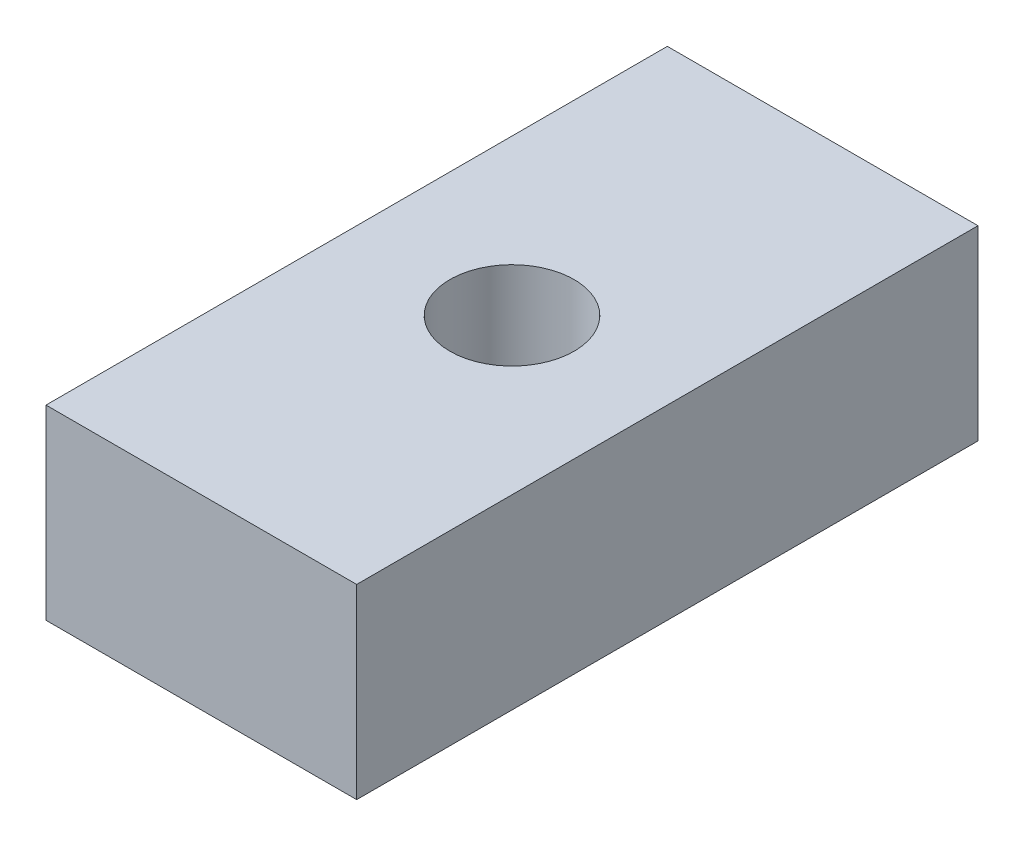
ISO-10303-21;
HEADER;
FILE_DESCRIPTION(('STEP AP214'),'2;1');
FILE_NAME('part.step','',(''),(''),'','','');
FILE_SCHEMA(('AUTOMOTIVE_DESIGN { 1 0 10303 214 1 1 1 1 }'));
ENDSEC;
DATA;
#1=APPLICATION_CONTEXT('core data for automotive mechanical design processes');
#2=APPLICATION_PROTOCOL_DEFINITION('international standard','automotive_design',2000,#1);
#3=PRODUCT_CONTEXT('',#1,'mechanical');
#4=PRODUCT('Part','Part','',(#3));
#5=PRODUCT_RELATED_PRODUCT_CATEGORY('part','',(#4));
#6=PRODUCT_DEFINITION_FORMATION('','',#4);
#7=PRODUCT_DEFINITION_CONTEXT('part definition',#1,'design');
#8=PRODUCT_DEFINITION('design','',#6,#7);
#9=PRODUCT_DEFINITION_SHAPE('','',#8);
#10=(LENGTH_UNIT() NAMED_UNIT(*) SI_UNIT(.MILLI.,.METRE.));
#11=(NAMED_UNIT(*) PLANE_ANGLE_UNIT() SI_UNIT($,.RADIAN.));
#12=(NAMED_UNIT(*) SI_UNIT($,.STERADIAN.) SOLID_ANGLE_UNIT());
#13=UNCERTAINTY_MEASURE_WITH_UNIT(LENGTH_MEASURE(1.E-05),#10,'distance_accuracy_value','');
#14=(GEOMETRIC_REPRESENTATION_CONTEXT(3) GLOBAL_UNCERTAINTY_ASSIGNED_CONTEXT((#13)) GLOBAL_UNIT_ASSIGNED_CONTEXT((#10,
#11,#12)) REPRESENTATION_CONTEXT('',''));
#15=CARTESIAN_POINT('',(0.,0.,0.));
#16=DIRECTION('',(0.,0.,1.));
#17=DIRECTION('',(1.,0.,0.));
#18=AXIS2_PLACEMENT_3D('',#15,#16,#17);
#19=CARTESIAN_POINT('',(0.,3.,0.));
#20=DIRECTION('',(1.,0.,0.));
#21=DIRECTION('',(0.,0.,-1.));
#22=AXIS2_PLACEMENT_3D('',#19,#20,#21);
#23=PLANE('',#22);
#24=DIRECTION('',(0.,0.,1.));
#25=VECTOR('',#24,1.);
#26=CARTESIAN_POINT('',(0.,0.,0.));
#27=LINE('',#26,#25);
#28=CARTESIAN_POINT('',(0.,0.,0.));
#29=VERTEX_POINT('',#28);
#30=CARTESIAN_POINT('',(0.,0.,10.));
#31=VERTEX_POINT('',#30);
#32=EDGE_CURVE('E96',#29,#31,#27,.T.);
#33=ORIENTED_EDGE('',*,*,#32,.T.);
#34=DIRECTION('',(0.,-1.,0.));
#35=VECTOR('',#34,1.);
#36=CARTESIAN_POINT('',(0.,3.,10.));
#37=LINE('',#36,#35);
#38=CARTESIAN_POINT('',(0.,3.,10.));
#39=VERTEX_POINT('',#38);
#40=EDGE_CURVE('E11',#39,#31,#37,.T.);
#41=ORIENTED_EDGE('',*,*,#40,.F.);
#42=DIRECTION('',(0.,0.,1.));
#43=VECTOR('',#42,1.);
#44=CARTESIAN_POINT('',(0.,3.,0.));
#45=LINE('',#44,#43);
#46=CARTESIAN_POINT('',(0.,3.,0.));
#47=VERTEX_POINT('',#46);
#48=EDGE_CURVE('E84',#47,#39,#45,.T.);
#49=ORIENTED_EDGE('',*,*,#48,.F.);
#50=DIRECTION('',(0.,-1.,0.));
#51=VECTOR('',#50,1.);
#52=CARTESIAN_POINT('',(0.,3.,0.));
#53=LINE('',#52,#51);
#54=EDGE_CURVE('E92',#47,#29,#53,.T.);
#55=ORIENTED_EDGE('',*,*,#54,.T.);
#56=EDGE_LOOP('',(#33,#41,#49,#55));
#57=FACE_BOUND('',#56,.T.);
#58=ADVANCED_FACE('F33',(#57),#23,.F.);
#59=CARTESIAN_POINT('',(0.,3.,10.));
#60=DIRECTION('',(0.,0.,-1.));
#61=DIRECTION('',(-1.,0.,0.));
#62=AXIS2_PLACEMENT_3D('',#59,#60,#61);
#63=PLANE('',#62);
#64=DIRECTION('',(1.,0.,0.));
#65=VECTOR('',#64,1.);
#66=CARTESIAN_POINT('',(0.,0.,10.));
#67=LINE('',#66,#65);
#68=CARTESIAN_POINT('',(5.,0.,10.));
#69=VERTEX_POINT('',#68);
#70=EDGE_CURVE('E88',#31,#69,#67,.T.);
#71=ORIENTED_EDGE('',*,*,#70,.T.);
#72=DIRECTION('',(0.,-1.,0.));
#73=VECTOR('',#72,1.);
#74=CARTESIAN_POINT('',(5.,3.,10.));
#75=LINE('',#74,#73);
#76=CARTESIAN_POINT('',(5.,3.,10.));
#77=VERTEX_POINT('',#76);
#78=EDGE_CURVE('E41',#77,#69,#75,.T.);
#79=ORIENTED_EDGE('',*,*,#78,.F.);
#80=DIRECTION('',(1.,0.,0.));
#81=VECTOR('',#80,1.);
#82=CARTESIAN_POINT('',(0.,3.,10.));
#83=LINE('',#82,#81);
#84=EDGE_CURVE('E79',#39,#77,#83,.T.);
#85=ORIENTED_EDGE('',*,*,#84,.F.);
#86=ORIENTED_EDGE('',*,*,#40,.T.);
#87=EDGE_LOOP('',(#71,#79,#85,#86));
#88=FACE_BOUND('',#87,.T.);
#89=ADVANCED_FACE('F87',(#88),#63,.F.);
#90=CARTESIAN_POINT('',(5.,3.,0.));
#91=DIRECTION('',(-1.,0.,0.));
#92=DIRECTION('',(0.,0.,1.));
#93=AXIS2_PLACEMENT_3D('',#90,#91,#92);
#94=PLANE('',#93);
#95=DIRECTION('',(0.,0.,-1.));
#96=VECTOR('',#95,1.);
#97=CARTESIAN_POINT('',(5.,0.,0.));
#98=LINE('',#97,#96);
#99=CARTESIAN_POINT('',(5.,0.,0.));
#100=VERTEX_POINT('',#99);
#101=EDGE_CURVE('E66',#69,#100,#98,.T.);
#102=ORIENTED_EDGE('',*,*,#101,.T.);
#103=DIRECTION('',(0.,-1.,0.));
#104=VECTOR('',#103,1.);
#105=CARTESIAN_POINT('',(5.,3.,0.));
#106=LINE('',#105,#104);
#107=CARTESIAN_POINT('',(5.,3.,0.));
#108=VERTEX_POINT('',#107);
#109=EDGE_CURVE('E89',#108,#100,#106,.T.);
#110=ORIENTED_EDGE('',*,*,#109,.F.);
#111=DIRECTION('',(0.,0.,-1.));
#112=VECTOR('',#111,1.);
#113=CARTESIAN_POINT('',(5.,3.,0.));
#114=LINE('',#113,#112);
#115=EDGE_CURVE('E82',#77,#108,#114,.T.);
#116=ORIENTED_EDGE('',*,*,#115,.F.);
#117=ORIENTED_EDGE('',*,*,#78,.T.);
#118=EDGE_LOOP('',(#102,#110,#116,#117));
#119=FACE_BOUND('',#118,.T.);
#120=ADVANCED_FACE('F90',(#119),#94,.F.);
#121=CARTESIAN_POINT('',(0.,3.,0.));
#122=DIRECTION('',(0.,0.,1.));
#123=DIRECTION('',(1.,0.,0.));
#124=AXIS2_PLACEMENT_3D('',#121,#122,#123);
#125=PLANE('',#124);
#126=DIRECTION('',(-1.,0.,0.));
#127=VECTOR('',#126,1.);
#128=CARTESIAN_POINT('',(0.,0.,0.));
#129=LINE('',#128,#127);
#130=EDGE_CURVE('E72',#100,#29,#129,.T.);
#131=ORIENTED_EDGE('',*,*,#130,.T.);
#132=ORIENTED_EDGE('',*,*,#54,.F.);
#133=DIRECTION('',(-1.,0.,0.));
#134=VECTOR('',#133,1.);
#135=CARTESIAN_POINT('',(0.,3.,0.));
#136=LINE('',#135,#134);
#137=EDGE_CURVE('E49',#108,#47,#136,.T.);
#138=ORIENTED_EDGE('',*,*,#137,.F.);
#139=ORIENTED_EDGE('',*,*,#109,.T.);
#140=EDGE_LOOP('',(#131,#132,#138,#139));
#141=FACE_BOUND('',#140,.T.);
#142=ADVANCED_FACE('F104',(#141),#125,.F.);
#143=CARTESIAN_POINT('',(0.,3.,0.));
#144=DIRECTION('',(0.,1.,0.));
#145=DIRECTION('',(0.,0.,1.));
#146=AXIS2_PLACEMENT_3D('',#143,#144,#145);
#147=PLANE('',#146);
#148=CARTESIAN_POINT('',(2.5,3.,5.));
#149=DIRECTION('',(0.,1.,0.));
#150=DIRECTION('',(0.,0.,1.));
#151=AXIS2_PLACEMENT_3D('',#148,#149,#150);
#152=CIRCLE('',#151,1.);
#153=CARTESIAN_POINT('',(2.5,3.,6.));
#154=VERTEX_POINT('',#153);
#155=EDGE_CURVE('E110',#154,#154,#152,.T.);
#156=ORIENTED_EDGE('',*,*,#155,.F.);
#157=EDGE_LOOP('',(#156));
#158=FACE_BOUND('',#157,.T.);
#159=ORIENTED_EDGE('',*,*,#48,.T.);
#160=ORIENTED_EDGE('',*,*,#84,.T.);
#161=ORIENTED_EDGE('',*,*,#115,.T.);
#162=ORIENTED_EDGE('',*,*,#137,.T.);
#163=EDGE_LOOP('',(#159,#160,#161,#162));
#164=FACE_BOUND('',#163,.T.);
#165=ADVANCED_FACE('F80',(#158,#164),#147,.T.);
#166=CARTESIAN_POINT('',(0.,0.,0.));
#167=DIRECTION('',(0.,1.,0.));
#168=DIRECTION('',(0.,0.,1.));
#169=AXIS2_PLACEMENT_3D('',#166,#167,#168);
#170=PLANE('',#169);
#171=CARTESIAN_POINT('',(2.5,0.,5.));
#172=DIRECTION('',(0.,1.,0.));
#173=DIRECTION('',(0.,0.,1.));
#174=AXIS2_PLACEMENT_3D('',#171,#172,#173);
#175=CIRCLE('',#174,1.);
#176=CARTESIAN_POINT('',(2.5,0.,6.));
#177=VERTEX_POINT('',#176);
#178=EDGE_CURVE('E99',#177,#177,#175,.T.);
#179=ORIENTED_EDGE('',*,*,#178,.T.);
#180=EDGE_LOOP('',(#179));
#181=FACE_BOUND('',#180,.T.);
#182=ORIENTED_EDGE('',*,*,#32,.F.);
#183=ORIENTED_EDGE('',*,*,#130,.F.);
#184=ORIENTED_EDGE('',*,*,#101,.F.);
#185=ORIENTED_EDGE('',*,*,#70,.F.);
#186=EDGE_LOOP('',(#182,#183,#184,#185));
#187=FACE_BOUND('',#186,.T.);
#188=ADVANCED_FACE('F107',(#181,#187),#170,.F.);
#189=CARTESIAN_POINT('',(2.5,0.,5.));
#190=DIRECTION('',(0.,1.,0.));
#191=DIRECTION('',(0.,0.,1.));
#192=AXIS2_PLACEMENT_3D('',#189,#190,#191);
#193=CYLINDRICAL_SURFACE('',#192,1.);
#194=ORIENTED_EDGE('',*,*,#178,.F.);
#195=EDGE_LOOP('',(#194));
#196=FACE_BOUND('',#195,.T.);
#197=ORIENTED_EDGE('',*,*,#155,.T.);
#198=EDGE_LOOP('',(#197));
#199=FACE_BOUND('',#198,.T.);
#200=ADVANCED_FACE('F117',(#196,#199),#193,.F.);
#201=CLOSED_SHELL('',(#58,#89,#120,#142,#165,#188,#200));
#202=MANIFOLD_SOLID_BREP('B2',#201);
#203=ADVANCED_BREP_SHAPE_REPRESENTATION('',(#18,#202),#14);
#204=SHAPE_DEFINITION_REPRESENTATION(#9,#203);
ENDSEC;
END-ISO-10303-21;
